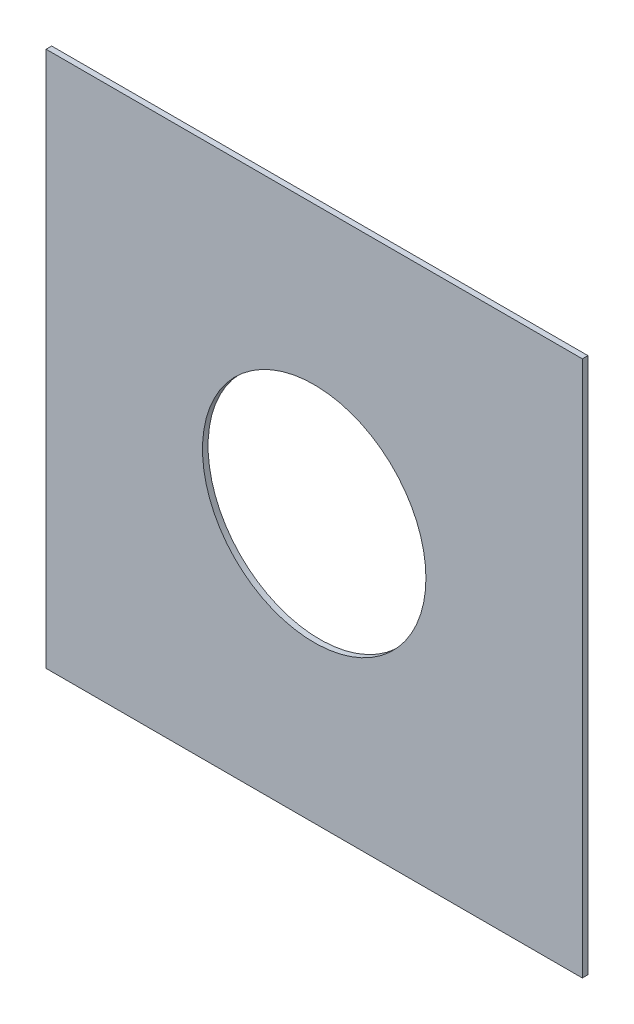
ISO-10303-21;
HEADER;
FILE_DESCRIPTION(('STEP AP214'),'2;1');
FILE_NAME('part.step','',(''),(''),'','','');
FILE_SCHEMA(('AUTOMOTIVE_DESIGN { 1 0 10303 214 1 1 1 1 }'));
ENDSEC;
DATA;
#1=APPLICATION_CONTEXT('core data for automotive mechanical design processes');
#2=APPLICATION_PROTOCOL_DEFINITION('international standard','automotive_design',2000,#1);
#3=PRODUCT_CONTEXT('',#1,'mechanical');
#4=PRODUCT('Part','Part','',(#3));
#5=PRODUCT_RELATED_PRODUCT_CATEGORY('part','',(#4));
#6=PRODUCT_DEFINITION_FORMATION('','',#4);
#7=PRODUCT_DEFINITION_CONTEXT('part definition',#1,'design');
#8=PRODUCT_DEFINITION('design','',#6,#7);
#9=PRODUCT_DEFINITION_SHAPE('','',#8);
#10=(LENGTH_UNIT() NAMED_UNIT(*) SI_UNIT(.MILLI.,.METRE.));
#11=(NAMED_UNIT(*) PLANE_ANGLE_UNIT() SI_UNIT($,.RADIAN.));
#12=(NAMED_UNIT(*) SI_UNIT($,.STERADIAN.) SOLID_ANGLE_UNIT());
#13=UNCERTAINTY_MEASURE_WITH_UNIT(LENGTH_MEASURE(1.E-05),#10,'distance_accuracy_value','');
#14=(GEOMETRIC_REPRESENTATION_CONTEXT(3) GLOBAL_UNCERTAINTY_ASSIGNED_CONTEXT((#13)) GLOBAL_UNIT_ASSIGNED_CONTEXT((#10,
#11,#12)) REPRESENTATION_CONTEXT('',''));
#15=CARTESIAN_POINT('',(0.,0.,0.));
#16=DIRECTION('',(0.,0.,1.));
#17=DIRECTION('',(1.,0.,0.));
#18=AXIS2_PLACEMENT_3D('',#15,#16,#17);
#19=CARTESIAN_POINT('',(152.4,152.4,3.175));
#20=DIRECTION('',(0.,0.,-1.));
#21=DIRECTION('',(-1.,0.,0.));
#22=AXIS2_PLACEMENT_3D('',#19,#20,#21);
#23=PLANE('',#22);
#24=DIRECTION('',(0.,1.,0.));
#25=VECTOR('',#24,1.);
#26=CARTESIAN_POINT('',(152.4,-152.4,3.175));
#27=LINE('',#26,#25);
#28=CARTESIAN_POINT('',(152.4,-152.4,3.175));
#29=VERTEX_POINT('',#28);
#30=CARTESIAN_POINT('',(152.4,152.4,3.175));
#31=VERTEX_POINT('',#30);
#32=EDGE_CURVE('E93',#29,#31,#27,.T.);
#33=ORIENTED_EDGE('',*,*,#32,.T.);
#34=DIRECTION('',(-1.,0.,0.));
#35=VECTOR('',#34,1.);
#36=CARTESIAN_POINT('',(-152.4,152.4,3.175));
#37=LINE('',#36,#35);
#38=CARTESIAN_POINT('',(-152.4,152.4,3.175));
#39=VERTEX_POINT('',#38);
#40=EDGE_CURVE('E88',#31,#39,#37,.T.);
#41=ORIENTED_EDGE('',*,*,#40,.T.);
#42=DIRECTION('',(0.,-1.,0.));
#43=VECTOR('',#42,1.);
#44=CARTESIAN_POINT('',(-152.4,-152.4,3.175));
#45=LINE('',#44,#43);
#46=CARTESIAN_POINT('',(-152.4,-152.4,3.175));
#47=VERTEX_POINT('',#46);
#48=EDGE_CURVE('E91',#39,#47,#45,.T.);
#49=ORIENTED_EDGE('',*,*,#48,.T.);
#50=DIRECTION('',(1.,0.,0.));
#51=VECTOR('',#50,1.);
#52=CARTESIAN_POINT('',(-152.4,-152.4,3.175));
#53=LINE('',#52,#51);
#54=EDGE_CURVE('E58',#47,#29,#53,.T.);
#55=ORIENTED_EDGE('',*,*,#54,.T.);
#56=EDGE_LOOP('',(#33,#41,#49,#55));
#57=FACE_BOUND('',#56,.T.);
#58=CARTESIAN_POINT('',(0.,0.,3.175));
#59=DIRECTION('',(0.,0.,1.));
#60=DIRECTION('',(1.,0.,0.));
#61=AXIS2_PLACEMENT_3D('',#58,#59,#60);
#62=CIRCLE('',#61,63.5);
#63=CARTESIAN_POINT('',(63.4999999999999,0.,3.175));
#64=VERTEX_POINT('',#63);
#65=EDGE_CURVE('E108',#64,#64,#62,.T.);
#66=ORIENTED_EDGE('',*,*,#65,.F.);
#67=EDGE_LOOP('',(#66));
#68=FACE_BOUND('',#67,.T.);
#69=ADVANCED_FACE('F41',(#57,#68),#23,.F.);
#70=CARTESIAN_POINT('',(152.4,152.4,0.));
#71=DIRECTION('',(0.,0.,-1.));
#72=DIRECTION('',(-1.,0.,0.));
#73=AXIS2_PLACEMENT_3D('',#70,#71,#72);
#74=PLANE('',#73);
#75=DIRECTION('',(0.,1.,0.));
#76=VECTOR('',#75,1.);
#77=CARTESIAN_POINT('',(152.4,-152.4,0.));
#78=LINE('',#77,#76);
#79=CARTESIAN_POINT('',(152.4,-152.4,0.));
#80=VERTEX_POINT('',#79);
#81=CARTESIAN_POINT('',(152.4,152.4,0.));
#82=VERTEX_POINT('',#81);
#83=EDGE_CURVE('E105',#80,#82,#78,.T.);
#84=ORIENTED_EDGE('',*,*,#83,.F.);
#85=DIRECTION('',(1.,0.,0.));
#86=VECTOR('',#85,1.);
#87=CARTESIAN_POINT('',(-152.4,-152.4,0.));
#88=LINE('',#87,#86);
#89=CARTESIAN_POINT('',(-152.4,-152.4,0.));
#90=VERTEX_POINT('',#89);
#91=EDGE_CURVE('E81',#90,#80,#88,.T.);
#92=ORIENTED_EDGE('',*,*,#91,.F.);
#93=DIRECTION('',(0.,-1.,0.));
#94=VECTOR('',#93,1.);
#95=CARTESIAN_POINT('',(-152.4,-152.4,0.));
#96=LINE('',#95,#94);
#97=CARTESIAN_POINT('',(-152.4,152.4,0.));
#98=VERTEX_POINT('',#97);
#99=EDGE_CURVE('E75',#98,#90,#96,.T.);
#100=ORIENTED_EDGE('',*,*,#99,.F.);
#101=DIRECTION('',(-1.,0.,0.));
#102=VECTOR('',#101,1.);
#103=CARTESIAN_POINT('',(-152.4,152.4,0.));
#104=LINE('',#103,#102);
#105=EDGE_CURVE('E97',#82,#98,#104,.T.);
#106=ORIENTED_EDGE('',*,*,#105,.F.);
#107=EDGE_LOOP('',(#84,#92,#100,#106));
#108=FACE_BOUND('',#107,.T.);
#109=CARTESIAN_POINT('',(0.,0.,0.));
#110=DIRECTION('',(0.,0.,1.));
#111=DIRECTION('',(1.,0.,0.));
#112=AXIS2_PLACEMENT_3D('',#109,#110,#111);
#113=CIRCLE('',#112,63.5);
#114=CARTESIAN_POINT('',(63.4999999999999,0.,0.));
#115=VERTEX_POINT('',#114);
#116=EDGE_CURVE('E120',#115,#115,#113,.T.);
#117=ORIENTED_EDGE('',*,*,#116,.T.);
#118=EDGE_LOOP('',(#117));
#119=FACE_BOUND('',#118,.T.);
#120=ADVANCED_FACE('F116',(#108,#119),#74,.T.);
#121=CARTESIAN_POINT('',(152.4,-152.4,3.175));
#122=DIRECTION('',(-1.,0.,0.));
#123=DIRECTION('',(0.,0.,1.));
#124=AXIS2_PLACEMENT_3D('',#121,#122,#123);
#125=PLANE('',#124);
#126=ORIENTED_EDGE('',*,*,#83,.T.);
#127=DIRECTION('',(0.,0.,-1.));
#128=VECTOR('',#127,1.);
#129=CARTESIAN_POINT('',(152.4,152.4,3.175));
#130=LINE('',#129,#128);
#131=EDGE_CURVE('E13',#31,#82,#130,.T.);
#132=ORIENTED_EDGE('',*,*,#131,.F.);
#133=ORIENTED_EDGE('',*,*,#32,.F.);
#134=DIRECTION('',(0.,0.,-1.));
#135=VECTOR('',#134,1.);
#136=CARTESIAN_POINT('',(152.4,-152.4,3.175));
#137=LINE('',#136,#135);
#138=EDGE_CURVE('E101',#29,#80,#137,.T.);
#139=ORIENTED_EDGE('',*,*,#138,.T.);
#140=EDGE_LOOP('',(#126,#132,#133,#139));
#141=FACE_BOUND('',#140,.T.);
#142=ADVANCED_FACE('F43',(#141),#125,.F.);
#143=CARTESIAN_POINT('',(-152.4,152.4,3.175));
#144=DIRECTION('',(0.,-1.,0.));
#145=DIRECTION('',(0.,0.,-1.));
#146=AXIS2_PLACEMENT_3D('',#143,#144,#145);
#147=PLANE('',#146);
#148=ORIENTED_EDGE('',*,*,#105,.T.);
#149=DIRECTION('',(0.,0.,-1.));
#150=VECTOR('',#149,1.);
#151=CARTESIAN_POINT('',(-152.4,152.4,3.175));
#152=LINE('',#151,#150);
#153=EDGE_CURVE('E50',#39,#98,#152,.T.);
#154=ORIENTED_EDGE('',*,*,#153,.F.);
#155=ORIENTED_EDGE('',*,*,#40,.F.);
#156=ORIENTED_EDGE('',*,*,#131,.T.);
#157=EDGE_LOOP('',(#148,#154,#155,#156));
#158=FACE_BOUND('',#157,.T.);
#159=ADVANCED_FACE('F96',(#158),#147,.F.);
#160=CARTESIAN_POINT('',(-152.4,-152.4,3.175));
#161=DIRECTION('',(1.,0.,0.));
#162=DIRECTION('',(0.,0.,-1.));
#163=AXIS2_PLACEMENT_3D('',#160,#161,#162);
#164=PLANE('',#163);
#165=ORIENTED_EDGE('',*,*,#99,.T.);
#166=DIRECTION('',(0.,0.,-1.));
#167=VECTOR('',#166,1.);
#168=CARTESIAN_POINT('',(-152.4,-152.4,3.175));
#169=LINE('',#168,#167);
#170=EDGE_CURVE('E98',#47,#90,#169,.T.);
#171=ORIENTED_EDGE('',*,*,#170,.F.);
#172=ORIENTED_EDGE('',*,*,#48,.F.);
#173=ORIENTED_EDGE('',*,*,#153,.T.);
#174=EDGE_LOOP('',(#165,#171,#172,#173));
#175=FACE_BOUND('',#174,.T.);
#176=ADVANCED_FACE('F99',(#175),#164,.F.);
#177=CARTESIAN_POINT('',(-152.4,-152.4,3.175));
#178=DIRECTION('',(0.,1.,0.));
#179=DIRECTION('',(0.,0.,1.));
#180=AXIS2_PLACEMENT_3D('',#177,#178,#179);
#181=PLANE('',#180);
#182=ORIENTED_EDGE('',*,*,#91,.T.);
#183=ORIENTED_EDGE('',*,*,#138,.F.);
#184=ORIENTED_EDGE('',*,*,#54,.F.);
#185=ORIENTED_EDGE('',*,*,#170,.T.);
#186=EDGE_LOOP('',(#182,#183,#184,#185));
#187=FACE_BOUND('',#186,.T.);
#188=ADVANCED_FACE('F113',(#187),#181,.F.);
#189=CARTESIAN_POINT('',(0.,0.,3.175));
#190=DIRECTION('',(0.,0.,-1.));
#191=DIRECTION('',(-1.,0.,0.));
#192=AXIS2_PLACEMENT_3D('',#189,#190,#191);
#193=CYLINDRICAL_SURFACE('',#192,63.5);
#194=ORIENTED_EDGE('',*,*,#65,.T.);
#195=EDGE_LOOP('',(#194));
#196=FACE_BOUND('',#195,.T.);
#197=ORIENTED_EDGE('',*,*,#116,.F.);
#198=EDGE_LOOP('',(#197));
#199=FACE_BOUND('',#198,.T.);
#200=ADVANCED_FACE('F126',(#196,#199),#193,.F.);
#201=CLOSED_SHELL('',(#69,#120,#142,#159,#176,#188,#200));
#202=MANIFOLD_SOLID_BREP('B2',#201);
#203=ADVANCED_BREP_SHAPE_REPRESENTATION('',(#18,#202),#14);
#204=SHAPE_DEFINITION_REPRESENTATION(#9,#203);
ENDSEC;
END-ISO-10303-21;
